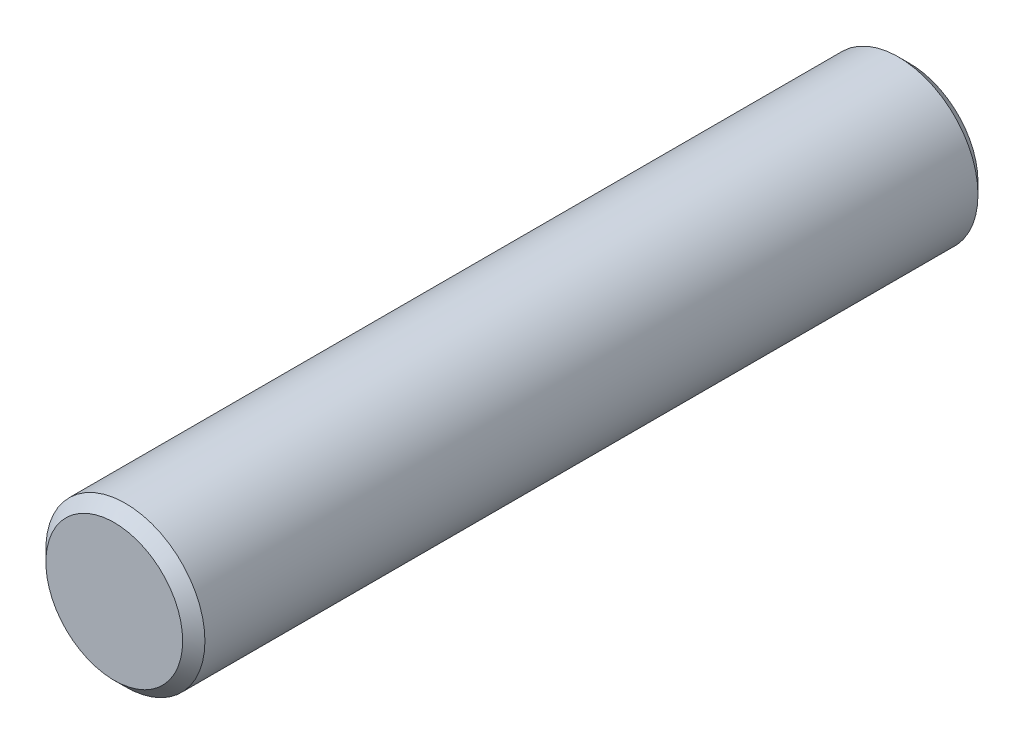
ISO-10303-21;
HEADER;
FILE_DESCRIPTION(('STEP AP214'),'2;1');
FILE_NAME('part.step','',(''),(''),'','','');
FILE_SCHEMA(('AUTOMOTIVE_DESIGN { 1 0 10303 214 1 1 1 1 }'));
ENDSEC;
DATA;
#1=APPLICATION_CONTEXT('core data for automotive mechanical design processes');
#2=APPLICATION_PROTOCOL_DEFINITION('international standard','automotive_design',2000,#1);
#3=PRODUCT_CONTEXT('',#1,'mechanical');
#4=PRODUCT('Part','Part','',(#3));
#5=PRODUCT_RELATED_PRODUCT_CATEGORY('part','',(#4));
#6=PRODUCT_DEFINITION_FORMATION('','',#4);
#7=PRODUCT_DEFINITION_CONTEXT('part definition',#1,'design');
#8=PRODUCT_DEFINITION('design','',#6,#7);
#9=PRODUCT_DEFINITION_SHAPE('','',#8);
#10=(LENGTH_UNIT() NAMED_UNIT(*) SI_UNIT(.MILLI.,.METRE.));
#11=(NAMED_UNIT(*) PLANE_ANGLE_UNIT() SI_UNIT($,.RADIAN.));
#12=(NAMED_UNIT(*) SI_UNIT($,.STERADIAN.) SOLID_ANGLE_UNIT());
#13=UNCERTAINTY_MEASURE_WITH_UNIT(LENGTH_MEASURE(1.E-05),#10,'distance_accuracy_value','');
#14=(GEOMETRIC_REPRESENTATION_CONTEXT(3) GLOBAL_UNCERTAINTY_ASSIGNED_CONTEXT((#13)) GLOBAL_UNIT_ASSIGNED_CONTEXT((#10,
#11,#12)) REPRESENTATION_CONTEXT('',''));
#15=CARTESIAN_POINT('',(0.,0.,0.));
#16=DIRECTION('',(0.,0.,1.));
#17=DIRECTION('',(1.,0.,0.));
#18=AXIS2_PLACEMENT_3D('',#15,#16,#17);
#19=CARTESIAN_POINT('',(0.,0.,15.));
#20=DIRECTION('',(0.,0.,-1.));
#21=DIRECTION('',(-1.,0.,0.));
#22=AXIS2_PLACEMENT_3D('',#19,#20,#21);
#23=CYLINDRICAL_SURFACE('',#22,1.5);
#24=CARTESIAN_POINT('',(0.,0.,0.209999999999998));
#25=DIRECTION('',(0.,0.,1.));
#26=DIRECTION('',(1.,0.,0.));
#27=AXIS2_PLACEMENT_3D('',#24,#25,#26);
#28=CIRCLE('',#27,1.5);
#29=CARTESIAN_POINT('',(1.5,0.,0.209999999999998));
#30=VERTEX_POINT('',#29);
#31=EDGE_CURVE('E39',#30,#30,#28,.T.);
#32=ORIENTED_EDGE('',*,*,#31,.T.);
#33=EDGE_LOOP('',(#32));
#34=FACE_BOUND('',#33,.T.);
#35=CARTESIAN_POINT('',(0.,0.,14.79));
#36=DIRECTION('',(0.,0.,1.));
#37=DIRECTION('',(1.,0.,0.));
#38=AXIS2_PLACEMENT_3D('',#35,#36,#37);
#39=CIRCLE('',#38,1.5);
#40=CARTESIAN_POINT('',(1.5,0.,14.79));
#41=VERTEX_POINT('',#40);
#42=EDGE_CURVE('E43',#41,#41,#39,.F.);
#43=ORIENTED_EDGE('',*,*,#42,.T.);
#44=EDGE_LOOP('',(#43));
#45=FACE_BOUND('',#44,.T.);
#46=ADVANCED_FACE('F29',(#34,#45),#23,.T.);
#47=CARTESIAN_POINT('',(0.,0.,15.));
#48=DIRECTION('',(0.,0.,1.));
#49=DIRECTION('',(1.,0.,0.));
#50=AXIS2_PLACEMENT_3D('',#47,#48,#49);
#51=PLANE('',#50);
#52=CARTESIAN_POINT('',(0.,0.,15.));
#53=DIRECTION('',(0.,0.,1.));
#54=DIRECTION('',(1.,0.,0.));
#55=AXIS2_PLACEMENT_3D('',#52,#53,#54);
#56=CIRCLE('',#55,1.29);
#57=CARTESIAN_POINT('',(1.29,0.,15.));
#58=VERTEX_POINT('',#57);
#59=EDGE_CURVE('E10',#58,#58,#56,.T.);
#60=ORIENTED_EDGE('',*,*,#59,.T.);
#61=EDGE_LOOP('',(#60));
#62=FACE_BOUND('',#61,.T.);
#63=ADVANCED_FACE('F62',(#62),#51,.T.);
#64=CARTESIAN_POINT('',(0.,0.,0.));
#65=DIRECTION('',(0.,0.,1.));
#66=DIRECTION('',(1.,0.,0.));
#67=AXIS2_PLACEMENT_3D('',#64,#65,#66);
#68=PLANE('',#67);
#69=CARTESIAN_POINT('',(0.,0.,0.));
#70=DIRECTION('',(0.,0.,1.));
#71=DIRECTION('',(1.,0.,0.));
#72=AXIS2_PLACEMENT_3D('',#69,#70,#71);
#73=CIRCLE('',#72,1.29);
#74=CARTESIAN_POINT('',(1.29,0.,0.));
#75=VERTEX_POINT('',#74);
#76=EDGE_CURVE('E35',#75,#75,#73,.F.);
#77=ORIENTED_EDGE('',*,*,#76,.T.);
#78=EDGE_LOOP('',(#77));
#79=FACE_BOUND('',#78,.T.);
#80=ADVANCED_FACE('F58',(#79),#68,.F.);
#81=CARTESIAN_POINT('',(0.,0.,0.209999999999998));
#82=DIRECTION('',(0.,0.,1.));
#83=DIRECTION('',(1.,0.,0.));
#84=AXIS2_PLACEMENT_3D('',#81,#82,#83);
#85=CONICAL_SURFACE('',#84,1.5,0.785398163397448);
#86=ORIENTED_EDGE('',*,*,#76,.F.);
#87=EDGE_LOOP('',(#86));
#88=FACE_BOUND('',#87,.T.);
#89=ORIENTED_EDGE('',*,*,#31,.F.);
#90=EDGE_LOOP('',(#89));
#91=FACE_BOUND('',#90,.T.);
#92=ADVANCED_FACE('F53',(#88,#91),#85,.T.);
#93=CARTESIAN_POINT('',(0.,0.,15.));
#94=DIRECTION('',(0.,0.,-1.));
#95=DIRECTION('',(-1.,0.,0.));
#96=AXIS2_PLACEMENT_3D('',#93,#94,#95);
#97=CONICAL_SURFACE('',#96,1.29,0.785398163397449);
#98=ORIENTED_EDGE('',*,*,#42,.F.);
#99=EDGE_LOOP('',(#98));
#100=FACE_BOUND('',#99,.T.);
#101=ORIENTED_EDGE('',*,*,#59,.F.);
#102=EDGE_LOOP('',(#101));
#103=FACE_BOUND('',#102,.T.);
#104=ADVANCED_FACE('F50',(#100,#103),#97,.T.);
#105=CLOSED_SHELL('',(#46,#63,#80,#92,#104));
#106=MANIFOLD_SOLID_BREP('B2',#105);
#107=ADVANCED_BREP_SHAPE_REPRESENTATION('',(#18,#106),#14);
#108=SHAPE_DEFINITION_REPRESENTATION(#9,#107);
ENDSEC;
END-ISO-10303-21;
